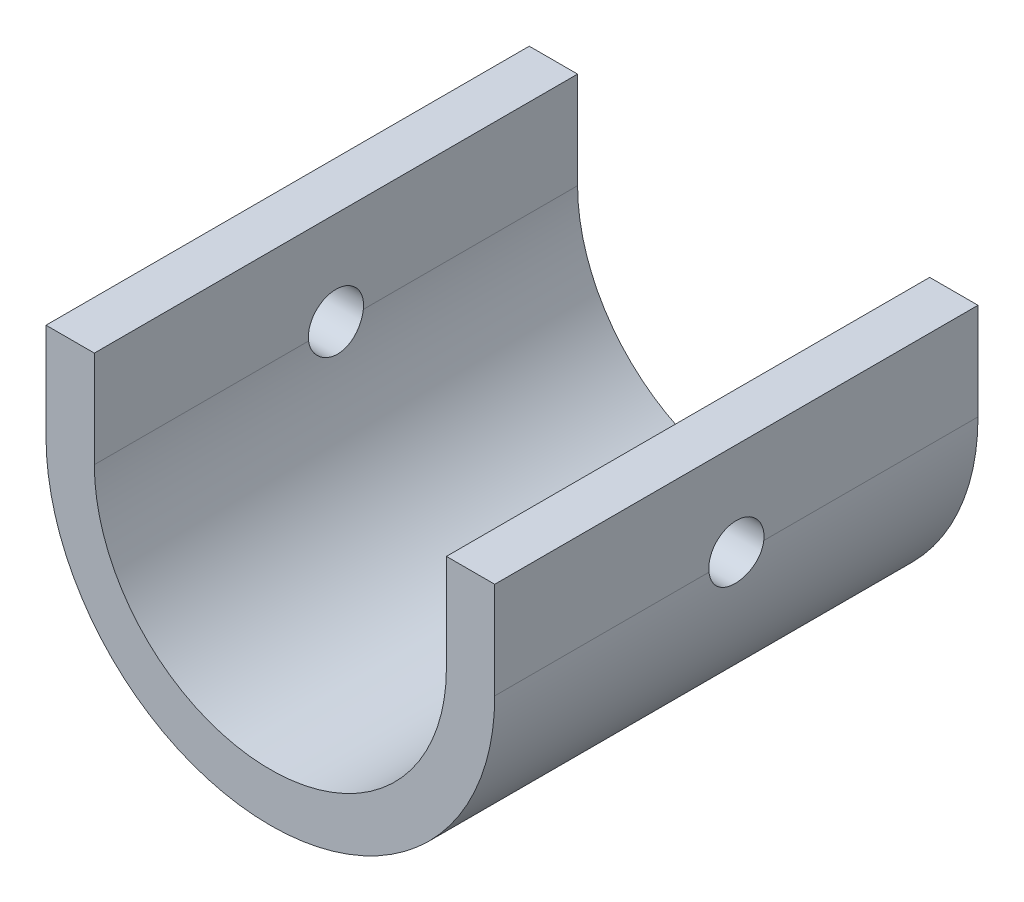
ISO-10303-21;
HEADER;
FILE_DESCRIPTION(('STEP AP214'),'2;1');
FILE_NAME('part.step','',(''),(''),'','','');
FILE_SCHEMA(('AUTOMOTIVE_DESIGN { 1 0 10303 214 1 1 1 1 }'));
ENDSEC;
DATA;
#1=APPLICATION_CONTEXT('core data for automotive mechanical design processes');
#2=APPLICATION_PROTOCOL_DEFINITION('international standard','automotive_design',2000,#1);
#3=PRODUCT_CONTEXT('',#1,'mechanical');
#4=PRODUCT('Part','Part','',(#3));
#5=PRODUCT_RELATED_PRODUCT_CATEGORY('part','',(#4));
#6=PRODUCT_DEFINITION_FORMATION('','',#4);
#7=PRODUCT_DEFINITION_CONTEXT('part definition',#1,'design');
#8=PRODUCT_DEFINITION('design','',#6,#7);
#9=PRODUCT_DEFINITION_SHAPE('','',#8);
#10=(LENGTH_UNIT() NAMED_UNIT(*) SI_UNIT(.MILLI.,.METRE.));
#11=(NAMED_UNIT(*) PLANE_ANGLE_UNIT() SI_UNIT($,.RADIAN.));
#12=(NAMED_UNIT(*) SI_UNIT($,.STERADIAN.) SOLID_ANGLE_UNIT());
#13=UNCERTAINTY_MEASURE_WITH_UNIT(LENGTH_MEASURE(1.E-05),#10,'distance_accuracy_value','');
#14=(GEOMETRIC_REPRESENTATION_CONTEXT(3) GLOBAL_UNCERTAINTY_ASSIGNED_CONTEXT((#13)) GLOBAL_UNIT_ASSIGNED_CONTEXT((#10,
#11,#12)) REPRESENTATION_CONTEXT('',''));
#15=CARTESIAN_POINT('',(0.,0.,0.));
#16=DIRECTION('',(0.,0.,1.));
#17=DIRECTION('',(1.,0.,0.));
#18=AXIS2_PLACEMENT_3D('',#15,#16,#17);
#19=CARTESIAN_POINT('',(0.,0.,-35.));
#20=DIRECTION('',(0.,0.,1.));
#21=DIRECTION('',(1.,0.,0.));
#22=AXIS2_PLACEMENT_3D('',#19,#20,#21);
#23=CYLINDRICAL_SURFACE('',#22,16.25);
#24=CARTESIAN_POINT('',(16.25,0.,-15.5156865167016));
#25=CARTESIAN_POINT('',(16.2500015653937,-0.055653435891597,-15.5226983306142));
#26=CARTESIAN_POINT('',(16.2497137674043,-0.110984720217965,-15.5320492738749));
#27=CARTESIAN_POINT('',(16.2485940851192,-0.220657744088929,-15.5553594094796));
#28=CARTESIAN_POINT('',(16.2477622439758,-0.27499956176471,-15.569318236292));
#29=CARTESIAN_POINT('',(16.2445065745714,-0.435836708734245,-15.6179434540853));
#30=CARTESIAN_POINT('',(16.2413223453314,-0.540353109414619,-15.6593851901989));
#31=CARTESIAN_POINT('',(16.2334116914427,-0.740915506000547,-15.7591232025484));
#32=CARTESIAN_POINT('',(16.2286847701001,-0.836958761175939,-15.8174249064255));
#33=CARTESIAN_POINT('',(16.2183398842306,-1.01792429968761,-15.9492291839831));
#34=CARTESIAN_POINT('',(16.2127220013382,-1.10284760058977,-16.0227303651986));
#35=CARTESIAN_POINT('',(16.201304162751,-1.25954696742681,-16.1832228231417));
#36=CARTESIAN_POINT('',(16.1955035321071,-1.33126535365999,-16.2702703555859));
#37=CARTESIAN_POINT('',(16.1844877892691,-1.45910416166925,-16.4552036602699));
#38=CARTESIAN_POINT('',(16.1792727555673,-1.51522249392426,-16.5530908819593));
#39=CARTESIAN_POINT('',(16.1700875480444,-1.61029953879071,-16.7570600110073));
#40=CARTESIAN_POINT('',(16.1661187427973,-1.64923940534476,-16.8631507690919));
#41=CARTESIAN_POINT('',(16.1599393704227,-1.70873124483421,-17.0804106559725));
#42=CARTESIAN_POINT('',(16.1577286462535,-1.72928486015344,-17.1915793302422));
#43=CARTESIAN_POINT('',(16.155352453196,-1.75134580655332,-17.4152542869928));
#44=CARTESIAN_POINT('',(16.1551768925576,-1.75294711711452,-17.5277511979941));
#45=CARTESIAN_POINT('',(16.1568669595704,-1.73729959616058,-17.7514103452006));
#46=CARTESIAN_POINT('',(16.1587325813369,-1.72005081899073,-17.8625725852527));
#47=CARTESIAN_POINT('',(16.1642628680002,-1.66727337904687,-18.0801419233242));
#48=CARTESIAN_POINT('',(16.1679232968112,-1.63178774926917,-18.1865595774253));
#49=CARTESIAN_POINT('',(16.1765819827535,-1.54358281846924,-18.3919369191943));
#50=CARTESIAN_POINT('',(16.1815802784569,-1.49086302055748,-18.4908963917293));
#51=CARTESIAN_POINT('',(16.192309993604,-1.36942168738256,-18.679008424877));
#52=CARTESIAN_POINT('',(16.198044438295,-1.3006331025488,-18.7681175224661));
#53=CARTESIAN_POINT('',(16.2094985117489,-1.14909339998459,-18.9335696466883));
#54=CARTESIAN_POINT('',(16.2152181386339,-1.06634059269709,-19.0099111263155));
#55=CARTESIAN_POINT('',(16.2259167931169,-0.888848502637455,-19.1479436428324));
#56=CARTESIAN_POINT('',(16.2308928300438,-0.794063509808882,-19.209576084041));
#57=CARTESIAN_POINT('',(16.2393898076645,-0.595449185629431,-19.3160078115115));
#58=CARTESIAN_POINT('',(16.2429118451123,-0.491626743086171,-19.3608197831562));
#59=CARTESIAN_POINT('',(16.2469244303084,-0.322298657730376,-19.4175078503865));
#60=CARTESIAN_POINT('',(16.2480663855521,-0.258738760865244,-19.4353375649568));
#61=CARTESIAN_POINT('',(16.2496054781649,-0.130264289473203,-19.4646205866167));
#62=CARTESIAN_POINT('',(16.250003795088,-0.0653520257485115,-19.4760839716058));
#63=CARTESIAN_POINT('',(16.25,0.,-19.4843134832984));
#64=B_SPLINE_CURVE_WITH_KNOTS('',3,(#24,#25,#26,#27,#28,#29,#30,#31,#32,#33,#34,#35,#36,#37,#38,
#39,#40,#41,#42,#43,#44,#45,#46,#47,#48,#49,#50,#51,#52,#53,#54,#55,#56,#57,#58,#59,#60,#61,#62,
#63),.UNSPECIFIED.,.F.,.F.,(4,2,2,2,2,2,2,2,2,2,2,2,2,2,2,2,2,2,2,4),(0.,0.168175927278946,
0.336338516794899,0.672038618206038,1.00784691032672,1.34362445176147,1.68083558443386,
2.0180918625036,2.35571722127854,2.69331241806959,3.02923286385338,3.36515234117233,
3.70028277346574,4.03542286897538,4.37198719004935,4.70859226189814,5.04651666784022,
5.38418570905532,5.58195955731673,5.77941943062865),.UNSPECIFIED.);
#65=CARTESIAN_POINT('',(16.25,0.,-15.5156865167016));
#66=VERTEX_POINT('',#65);
#67=CARTESIAN_POINT('',(16.25,0.,-19.4843134832984));
#68=VERTEX_POINT('',#67);
#69=EDGE_CURVE('E54',#66,#68,#64,.T.);
#70=ORIENTED_EDGE('',*,*,#69,.F.);
#71=DIRECTION('',(0.,0.,1.));
#72=VECTOR('',#71,1.);
#73=CARTESIAN_POINT('',(16.25,0.,-35.));
#74=LINE('',#73,#72);
#75=CARTESIAN_POINT('',(16.25,0.,0.));
#76=VERTEX_POINT('',#75);
#77=EDGE_CURVE('E135',#66,#76,#74,.T.);
#78=ORIENTED_EDGE('',*,*,#77,.T.);
#79=CARTESIAN_POINT('',(0.,0.,0.));
#80=DIRECTION('',(0.,0.,1.));
#81=DIRECTION('',(1.,0.,0.));
#82=AXIS2_PLACEMENT_3D('',#79,#80,#81);
#83=CIRCLE('',#82,16.25);
#84=CARTESIAN_POINT('',(-16.25,0.,0.));
#85=VERTEX_POINT('',#84);
#86=EDGE_CURVE('E166',#85,#76,#83,.T.);
#87=ORIENTED_EDGE('',*,*,#86,.F.);
#88=DIRECTION('',(0.,0.,1.));
#89=VECTOR('',#88,1.);
#90=CARTESIAN_POINT('',(-16.25,0.,-35.));
#91=LINE('',#90,#89);
#92=CARTESIAN_POINT('',(-16.25,0.,-15.5156865167016));
#93=VERTEX_POINT('',#92);
#94=EDGE_CURVE('E152',#93,#85,#91,.T.);
#95=ORIENTED_EDGE('',*,*,#94,.F.);
#96=CARTESIAN_POINT('',(-16.25,0.,-15.5156865167016));
#97=CARTESIAN_POINT('',(-16.2500015653937,-0.055653435891595,-15.5226983306142));
#98=CARTESIAN_POINT('',(-16.2497137674043,-0.110984720217963,-15.5320492738749));
#99=CARTESIAN_POINT('',(-16.2485940851192,-0.220657744088927,-15.5553594094796));
#100=CARTESIAN_POINT('',(-16.2477622439758,-0.274999561764708,-15.569318236292));
#101=CARTESIAN_POINT('',(-16.2445065745714,-0.435836708734243,-15.6179434540853));
#102=CARTESIAN_POINT('',(-16.2413223453314,-0.540353109414617,-15.6593851901989));
#103=CARTESIAN_POINT('',(-16.2334116914427,-0.740915506000545,-15.7591232025484));
#104=CARTESIAN_POINT('',(-16.2286847701001,-0.836958761175938,-15.8174249064255));
#105=CARTESIAN_POINT('',(-16.2183398842306,-1.01792429968761,-15.9492291839831));
#106=CARTESIAN_POINT('',(-16.2127220013382,-1.10284760058977,-16.0227303651986));
#107=CARTESIAN_POINT('',(-16.201304162751,-1.25954696742681,-16.1832228231417));
#108=CARTESIAN_POINT('',(-16.1955035321071,-1.33126535365999,-16.2702703555859));
#109=CARTESIAN_POINT('',(-16.1844877892691,-1.45910416166925,-16.4552036602699));
#110=CARTESIAN_POINT('',(-16.1792727555673,-1.51522249392426,-16.5530908819593));
#111=CARTESIAN_POINT('',(-16.1700875480444,-1.61029953879071,-16.7570600110073));
#112=CARTESIAN_POINT('',(-16.1661187427973,-1.64923940534476,-16.8631507690919));
#113=CARTESIAN_POINT('',(-16.1599393704227,-1.70873124483421,-17.0804106559725));
#114=CARTESIAN_POINT('',(-16.1577286462535,-1.72928486015344,-17.1915793302422));
#115=CARTESIAN_POINT('',(-16.155352453196,-1.75134580655332,-17.4152542869928));
#116=CARTESIAN_POINT('',(-16.1551768925576,-1.75294711711452,-17.5277511979941));
#117=CARTESIAN_POINT('',(-16.1568669595704,-1.73729959616058,-17.7514103452006));
#118=CARTESIAN_POINT('',(-16.1587325813369,-1.72005081899073,-17.8625725852527));
#119=CARTESIAN_POINT('',(-16.1642628680002,-1.66727337904687,-18.0801419233242));
#120=CARTESIAN_POINT('',(-16.1679232968112,-1.63178774926917,-18.1865595774253));
#121=CARTESIAN_POINT('',(-16.1765819827535,-1.54358281846924,-18.3919369191943));
#122=CARTESIAN_POINT('',(-16.1815802784569,-1.49086302055747,-18.4908963917293));
#123=CARTESIAN_POINT('',(-16.192309993604,-1.36942168738257,-18.679008424877));
#124=CARTESIAN_POINT('',(-16.198044438295,-1.3006331025488,-18.7681175224661));
#125=CARTESIAN_POINT('',(-16.2094985117489,-1.14909339998459,-18.9335696466883));
#126=CARTESIAN_POINT('',(-16.2152181386339,-1.06634059269709,-19.0099111263155));
#127=CARTESIAN_POINT('',(-16.2259167931169,-0.888848502637458,-19.1479436428324));
#128=CARTESIAN_POINT('',(-16.2308928300438,-0.794063509808885,-19.209576084041));
#129=CARTESIAN_POINT('',(-16.2393898076645,-0.595449185629433,-19.3160078115115));
#130=CARTESIAN_POINT('',(-16.2429118451123,-0.491626743086172,-19.3608197831562));
#131=CARTESIAN_POINT('',(-16.2469244303084,-0.322298657730376,-19.4175078503865));
#132=CARTESIAN_POINT('',(-16.2480663855521,-0.258738760865243,-19.4353375649568));
#133=CARTESIAN_POINT('',(-16.2496054781649,-0.130264289473201,-19.4646205866167));
#134=CARTESIAN_POINT('',(-16.250003795088,-0.065352025748509,-19.4760839716058));
#135=CARTESIAN_POINT('',(-16.25,0.,-19.4843134832984));
#136=B_SPLINE_CURVE_WITH_KNOTS('',3,(#96,#97,#98,#99,#100,#101,#102,#103,#104,#105,#106,#107,
#108,#109,#110,#111,#112,#113,#114,#115,#116,#117,#118,#119,#120,#121,#122,#123,#124,#125,#126,
#127,#128,#129,#130,#131,#132,#133,#134,#135),.UNSPECIFIED.,.F.,.F.,(4,2,2,2,2,2,2,2,2,2,2,2,2,
2,2,2,2,2,2,4),(0.,0.168175927278946,0.336338516794899,0.672038618206038,1.00784691032672,
1.34362445176147,1.68083558443386,2.0180918625036,2.35571722127855,2.69331241806959,
3.02923286385339,3.36515234117233,3.70028277346575,4.03542286897538,4.37198719004935,
4.70859226189814,5.04651666784021,5.38418570905532,5.58195955731673,5.77941943062865),.UNSPECIFIED.);
#137=CARTESIAN_POINT('',(-16.25,0.,-19.4843134832984));
#138=VERTEX_POINT('',#137);
#139=EDGE_CURVE('E257',#93,#138,#136,.T.);
#140=ORIENTED_EDGE('',*,*,#139,.T.);
#141=CARTESIAN_POINT('',(-16.25,0.,-35.));
#142=VERTEX_POINT('',#141);
#143=EDGE_CURVE('E157',#142,#138,#91,.T.);
#144=ORIENTED_EDGE('',*,*,#143,.F.);
#145=CARTESIAN_POINT('',(0.,0.,-35.));
#146=DIRECTION('',(0.,0.,1.));
#147=DIRECTION('',(1.,0.,0.));
#148=AXIS2_PLACEMENT_3D('',#145,#146,#147);
#149=CIRCLE('',#148,16.25);
#150=CARTESIAN_POINT('',(16.25,0.,-35.));
#151=VERTEX_POINT('',#150);
#152=EDGE_CURVE('E170',#142,#151,#149,.T.);
#153=ORIENTED_EDGE('',*,*,#152,.T.);
#154=EDGE_CURVE('E138',#151,#68,#74,.T.);
#155=ORIENTED_EDGE('',*,*,#154,.T.);
#156=EDGE_LOOP('',(#70,#78,#87,#95,#140,#144,#153,#155));
#157=FACE_BOUND('',#156,.T.);
#158=ADVANCED_FACE('F39',(#157),#23,.T.);
#159=CARTESIAN_POINT('',(0.,0.,-35.));
#160=DIRECTION('',(0.,0.,1.));
#161=DIRECTION('',(1.,0.,0.));
#162=AXIS2_PLACEMENT_3D('',#159,#160,#161);
#163=CYLINDRICAL_SURFACE('',#162,12.75);
#164=DIRECTION('',(0.,0.,1.));
#165=VECTOR('',#164,1.);
#166=CARTESIAN_POINT('',(12.75,0.,-35.));
#167=LINE('',#166,#165);
#168=CARTESIAN_POINT('',(12.75,0.,0.));
#169=VERTEX_POINT('',#168);
#170=CARTESIAN_POINT('',(12.75,0.,-15.5156865167016));
#171=VERTEX_POINT('',#170);
#172=EDGE_CURVE('E181',#169,#171,#167,.F.);
#173=ORIENTED_EDGE('',*,*,#172,.T.);
#174=CARTESIAN_POINT('',(12.75,0.,-15.5156865167016));
#175=CARTESIAN_POINT('',(12.7500019823259,-0.0555459104248471,-15.5226846392623));
#176=CARTESIAN_POINT('',(12.7496366052787,-0.110770606036139,-15.5320131071527));
#177=CARTESIAN_POINT('',(12.7482150311856,-0.220230793773209,-15.5552593693715));
#178=CARTESIAN_POINT('',(12.7471589022158,-0.274466382837561,-15.5691767113832));
#179=CARTESIAN_POINT('',(12.7430256795552,-0.43496945274398,-15.6176424606988));
#180=CARTESIAN_POINT('',(12.738983398653,-0.539260279929183,-15.6589334558758));
#181=CARTESIAN_POINT('',(12.7289389113226,-0.739384796080866,-15.7582713081251));
#182=CARTESIAN_POINT('',(12.7229362431457,-0.835216485824843,-15.8163221124199));
#183=CARTESIAN_POINT('',(12.7097916366241,-1.01582448559224,-15.9475372306867));
#184=CARTESIAN_POINT('',(12.7026497302155,-1.10060110540118,-16.0207011210108));
#185=CARTESIAN_POINT('',(12.6881016648746,-1.25730985932378,-16.1806660809222));
#186=CARTESIAN_POINT('',(12.6806940250715,-1.32914953695951,-16.267557577447));
#187=CARTESIAN_POINT('',(12.6666109107127,-1.4572697596049,-16.45221256416));
#188=CARTESIAN_POINT('',(12.6599355277796,-1.51354835889452,-16.549977411785));
#189=CARTESIAN_POINT('',(12.6481578812441,-1.60901598087677,-16.7538422776427));
#190=CARTESIAN_POINT('',(12.6430586083877,-1.64817257137658,-16.8599576687502));
#191=CARTESIAN_POINT('',(12.6351057220364,-1.70807654235961,-17.0773369283919));
#192=CARTESIAN_POINT('',(12.6322518622685,-1.72882594174195,-17.1886002308949));
#193=CARTESIAN_POINT('',(12.6291696595492,-1.75120030356984,-17.4121606088703));
#194=CARTESIAN_POINT('',(12.6289203167666,-1.75297823265907,-17.524442098232));
#195=CARTESIAN_POINT('',(12.6310241032355,-1.73775348480014,-17.747698231883));
#196=CARTESIAN_POINT('',(12.6333772002391,-1.72075104056776,-17.8586728923485));
#197=CARTESIAN_POINT('',(12.6403727285631,-1.66857995697854,-18.0757277552502));
#198=CARTESIAN_POINT('',(12.6450062231918,-1.63348220630697,-18.1818253101163));
#199=CARTESIAN_POINT('',(12.6559767728514,-1.54618121223193,-18.38663799082));
#200=CARTESIAN_POINT('',(12.6623139107521,-1.49397713670304,-18.48535275724));
#201=CARTESIAN_POINT('',(12.6759470668604,-1.37351839633283,-18.6733446364352));
#202=CARTESIAN_POINT('',(12.6832494173857,-1.3051551554944,-18.7625517094753));
#203=CARTESIAN_POINT('',(12.6978511635886,-1.15446540349922,-18.9282931665022));
#204=CARTESIAN_POINT('',(12.7051505587428,-1.07213703245764,-19.0048258598205));
#205=CARTESIAN_POINT('',(12.7188420090206,-0.895247555729168,-19.1435092313658));
#206=CARTESIAN_POINT('',(12.7252281064842,-0.800613192864179,-19.2055670070589));
#207=CARTESIAN_POINT('',(12.7361574117312,-0.602186721294556,-19.3128633984538));
#208=CARTESIAN_POINT('',(12.7407020320764,-0.498401706576717,-19.3581149036922));
#209=CARTESIAN_POINT('',(12.7459393213529,-0.328013267084846,-19.4158338823871));
#210=CARTESIAN_POINT('',(12.7474465395899,-0.263358420275937,-19.4341578445234));
#211=CARTESIAN_POINT('',(12.7494787915869,-0.132619593209395,-19.4642037860857));
#212=CARTESIAN_POINT('',(12.7500052904795,-0.0665378942361266,-19.4759355954279));
#213=CARTESIAN_POINT('',(12.75,0.,-19.4843134832985));
#214=B_SPLINE_CURVE_WITH_KNOTS('',3,(#174,#175,#176,#177,#178,#179,#180,#181,#182,#183,#184,
#185,#186,#187,#188,#189,#190,#191,#192,#193,#194,#195,#196,#197,#198,#199,#200,#201,#202,#203,
#204,#205,#206,#207,#208,#209,#210,#211,#212,#213),.UNSPECIFIED.,.F.,.F.,(4,2,2,2,2,2,2,2,2,2,2,
2,2,2,2,2,2,2,2,4),(0.,0.167850371346322,0.335684202939616,0.670674074812966,1.005742906997,
1.34080234785317,1.67816875686227,2.0155773303046,2.35362227715581,2.69163014268098,
3.02691057723162,3.36218685722323,3.69615955554619,4.03014850215376,4.36644877830834,
4.70279387836108,5.04124169184351,5.37942939476462,5.5807681315005,5.78180583894589),.UNSPECIFIED.);
#215=CARTESIAN_POINT('',(12.75,0.,-19.4843134832984));
#216=VERTEX_POINT('',#215);
#217=EDGE_CURVE('E60',#171,#216,#214,.T.);
#218=ORIENTED_EDGE('',*,*,#217,.T.);
#219=CARTESIAN_POINT('',(12.75,0.,-35.));
#220=VERTEX_POINT('',#219);
#221=EDGE_CURVE('E180',#216,#220,#167,.F.);
#222=ORIENTED_EDGE('',*,*,#221,.T.);
#223=CARTESIAN_POINT('',(0.,0.,-35.));
#224=DIRECTION('',(0.,0.,1.));
#225=DIRECTION('',(1.,0.,0.));
#226=AXIS2_PLACEMENT_3D('',#223,#224,#225);
#227=CIRCLE('',#226,12.75);
#228=CARTESIAN_POINT('',(-12.75,0.,-35.));
#229=VERTEX_POINT('',#228);
#230=EDGE_CURVE('E162',#229,#220,#227,.T.);
#231=ORIENTED_EDGE('',*,*,#230,.F.);
#232=DIRECTION('',(0.,0.,1.));
#233=VECTOR('',#232,1.);
#234=CARTESIAN_POINT('',(-12.75,0.,-35.));
#235=LINE('',#234,#233);
#236=CARTESIAN_POINT('',(-12.75,0.,-19.4843134832984));
#237=VERTEX_POINT('',#236);
#238=EDGE_CURVE('E176',#229,#237,#235,.T.);
#239=ORIENTED_EDGE('',*,*,#238,.T.);
#240=CARTESIAN_POINT('',(-12.75,0.,-15.5156865167016));
#241=CARTESIAN_POINT('',(-12.7500019823259,-0.0555459104248455,-15.5226846392623));
#242=CARTESIAN_POINT('',(-12.7496366052787,-0.110770606036138,-15.5320131071527));
#243=CARTESIAN_POINT('',(-12.7482150311856,-0.220230793773207,-15.5552593693715));
#244=CARTESIAN_POINT('',(-12.7471589022158,-0.27446638283756,-15.5691767113832));
#245=CARTESIAN_POINT('',(-12.7430256795552,-0.434969452743979,-15.6176424606988));
#246=CARTESIAN_POINT('',(-12.738983398653,-0.539260279929181,-15.6589334558758));
#247=CARTESIAN_POINT('',(-12.7289389113226,-0.739384796080865,-15.7582713081251));
#248=CARTESIAN_POINT('',(-12.7229362431457,-0.835216485824842,-15.8163221124199));
#249=CARTESIAN_POINT('',(-12.7097916366241,-1.01582448559224,-15.9475372306867));
#250=CARTESIAN_POINT('',(-12.7026497302155,-1.10060110540118,-16.0207011210108));
#251=CARTESIAN_POINT('',(-12.6881016648746,-1.25730985932378,-16.1806660809222));
#252=CARTESIAN_POINT('',(-12.6806940250715,-1.3291495369595,-16.267557577447));
#253=CARTESIAN_POINT('',(-12.6666109107127,-1.4572697596049,-16.45221256416));
#254=CARTESIAN_POINT('',(-12.6599355277796,-1.51354835889452,-16.549977411785));
#255=CARTESIAN_POINT('',(-12.6481578812441,-1.60901598087677,-16.7538422776427));
#256=CARTESIAN_POINT('',(-12.6430586083877,-1.64817257137658,-16.8599576687502));
#257=CARTESIAN_POINT('',(-12.6351057220364,-1.70807654235961,-17.0773369283919));
#258=CARTESIAN_POINT('',(-12.6322518622685,-1.72882594174195,-17.1886002308949));
#259=CARTESIAN_POINT('',(-12.6291696595492,-1.75120030356984,-17.4121606088703));
#260=CARTESIAN_POINT('',(-12.6289203167666,-1.75297823265907,-17.524442098232));
#261=CARTESIAN_POINT('',(-12.6310241032355,-1.73775348480014,-17.747698231883));
#262=CARTESIAN_POINT('',(-12.6333772002391,-1.72075104056776,-17.8586728923485));
#263=CARTESIAN_POINT('',(-12.6403727285631,-1.66857995697854,-18.0757277552502));
#264=CARTESIAN_POINT('',(-12.6450062231918,-1.63348220630697,-18.1818253101163));
#265=CARTESIAN_POINT('',(-12.6559767728514,-1.54618121223193,-18.38663799082));
#266=CARTESIAN_POINT('',(-12.6623139107521,-1.49397713670304,-18.48535275724));
#267=CARTESIAN_POINT('',(-12.6759470668604,-1.37351839633283,-18.6733446364352));
#268=CARTESIAN_POINT('',(-12.6832494173857,-1.3051551554944,-18.7625517094753));
#269=CARTESIAN_POINT('',(-12.6978511635886,-1.15446540349922,-18.9282931665022));
#270=CARTESIAN_POINT('',(-12.7051505587428,-1.07213703245764,-19.0048258598205));
#271=CARTESIAN_POINT('',(-12.7188420090206,-0.895247555729171,-19.1435092313658));
#272=CARTESIAN_POINT('',(-12.7252281064842,-0.800613192864182,-19.2055670070589));
#273=CARTESIAN_POINT('',(-12.7361574117312,-0.602186721294558,-19.3128633984538));
#274=CARTESIAN_POINT('',(-12.7407020320764,-0.498401706576717,-19.3581149036922));
#275=CARTESIAN_POINT('',(-12.7459393213529,-0.328013267084846,-19.4158338823871));
#276=CARTESIAN_POINT('',(-12.7474465395899,-0.263358420275937,-19.4341578445234));
#277=CARTESIAN_POINT('',(-12.7494787915869,-0.132619593209394,-19.4642037860857));
#278=CARTESIAN_POINT('',(-12.7500052904795,-0.0665378942361256,-19.4759355954279));
#279=CARTESIAN_POINT('',(-12.75,0.,-19.4843134832985));
#280=B_SPLINE_CURVE_WITH_KNOTS('',3,(#240,#241,#242,#243,#244,#245,#246,#247,#248,#249,#250,
#251,#252,#253,#254,#255,#256,#257,#258,#259,#260,#261,#262,#263,#264,#265,#266,#267,#268,#269,
#270,#271,#272,#273,#274,#275,#276,#277,#278,#279),.UNSPECIFIED.,.F.,.F.,(4,2,2,2,2,2,2,2,2,2,2,
2,2,2,2,2,2,2,2,4),(0.,0.167850371346322,0.335684202939615,0.670674074812966,1.005742906997,
1.34080234785317,1.67816875686227,2.0155773303046,2.35362227715581,2.69163014268098,
3.02691057723162,3.36218685722323,3.69615955554619,4.03014850215376,4.36644877830834,
4.70279387836108,5.04124169184351,5.37942939476462,5.5807681315005,5.7818058389459),.UNSPECIFIED.);
#281=CARTESIAN_POINT('',(-12.75,0.,-15.5156865167016));
#282=VERTEX_POINT('',#281);
#283=EDGE_CURVE('E196',#282,#237,#280,.T.);
#284=ORIENTED_EDGE('',*,*,#283,.F.);
#285=CARTESIAN_POINT('',(-12.75,0.,0.));
#286=VERTEX_POINT('',#285);
#287=EDGE_CURVE('E173',#282,#286,#235,.T.);
#288=ORIENTED_EDGE('',*,*,#287,.T.);
#289=CARTESIAN_POINT('',(0.,0.,0.));
#290=DIRECTION('',(0.,0.,1.));
#291=DIRECTION('',(1.,0.,0.));
#292=AXIS2_PLACEMENT_3D('',#289,#290,#291);
#293=CIRCLE('',#292,12.75);
#294=EDGE_CURVE('E161',#286,#169,#293,.T.);
#295=ORIENTED_EDGE('',*,*,#294,.T.);
#296=EDGE_LOOP('',(#173,#218,#222,#231,#239,#284,#288,#295));
#297=FACE_BOUND('',#296,.T.);
#298=ADVANCED_FACE('F195',(#297),#163,.F.);
#299=CARTESIAN_POINT('',(0.,0.,-35.));
#300=DIRECTION('',(0.,0.,1.));
#301=DIRECTION('',(1.,0.,0.));
#302=AXIS2_PLACEMENT_3D('',#299,#300,#301);
#303=PLANE('',#302);
#304=DIRECTION('',(0.,-1.,0.));
#305=VECTOR('',#304,1.);
#306=CARTESIAN_POINT('',(12.75,7.,-35.));
#307=LINE('',#306,#305);
#308=CARTESIAN_POINT('',(12.75,7.,-35.));
#309=VERTEX_POINT('',#308);
#310=EDGE_CURVE('E203',#309,#220,#307,.T.);
#311=ORIENTED_EDGE('',*,*,#310,.F.);
#312=DIRECTION('',(-1.,0.,0.));
#313=VECTOR('',#312,1.);
#314=CARTESIAN_POINT('',(-16.25,7.,-35.));
#315=LINE('',#314,#313);
#316=CARTESIAN_POINT('',(16.25,7.,-35.));
#317=VERTEX_POINT('',#316);
#318=EDGE_CURVE('E232',#317,#309,#315,.T.);
#319=ORIENTED_EDGE('',*,*,#318,.F.);
#320=DIRECTION('',(0.,-1.,0.));
#321=VECTOR('',#320,1.);
#322=CARTESIAN_POINT('',(16.25,7.,-35.));
#323=LINE('',#322,#321);
#324=EDGE_CURVE('E238',#317,#151,#323,.T.);
#325=ORIENTED_EDGE('',*,*,#324,.T.);
#326=ORIENTED_EDGE('',*,*,#152,.F.);
#327=DIRECTION('',(0.,-1.,0.));
#328=VECTOR('',#327,1.);
#329=CARTESIAN_POINT('',(-16.25,7.,-35.));
#330=LINE('',#329,#328);
#331=CARTESIAN_POINT('',(-16.25,7.,-35.));
#332=VERTEX_POINT('',#331);
#333=EDGE_CURVE('E235',#332,#142,#330,.T.);
#334=ORIENTED_EDGE('',*,*,#333,.F.);
#335=CARTESIAN_POINT('',(-12.75,7.,-35.));
#336=VERTEX_POINT('',#335);
#337=EDGE_CURVE('E208',#336,#332,#315,.T.);
#338=ORIENTED_EDGE('',*,*,#337,.F.);
#339=DIRECTION('',(0.,-1.,0.));
#340=VECTOR('',#339,1.);
#341=CARTESIAN_POINT('',(-12.75,7.,-35.));
#342=LINE('',#341,#340);
#343=EDGE_CURVE('E206',#336,#229,#342,.T.);
#344=ORIENTED_EDGE('',*,*,#343,.T.);
#345=ORIENTED_EDGE('',*,*,#230,.T.);
#346=EDGE_LOOP('',(#311,#319,#325,#326,#334,#338,#344,#345));
#347=FACE_BOUND('',#346,.T.);
#348=ADVANCED_FACE('F201',(#347),#303,.F.);
#349=CARTESIAN_POINT('',(0.,0.,0.));
#350=DIRECTION('',(0.,0.,1.));
#351=DIRECTION('',(1.,0.,0.));
#352=AXIS2_PLACEMENT_3D('',#349,#350,#351);
#353=PLANE('',#352);
#354=DIRECTION('',(1.,0.,0.));
#355=VECTOR('',#354,1.);
#356=CARTESIAN_POINT('',(-16.25,7.,0.));
#357=LINE('',#356,#355);
#358=CARTESIAN_POINT('',(12.75,7.,0.));
#359=VERTEX_POINT('',#358);
#360=CARTESIAN_POINT('',(16.25,7.,0.));
#361=VERTEX_POINT('',#360);
#362=EDGE_CURVE('E224',#359,#361,#357,.T.);
#363=ORIENTED_EDGE('',*,*,#362,.F.);
#364=DIRECTION('',(0.,-1.,0.));
#365=VECTOR('',#364,1.);
#366=CARTESIAN_POINT('',(12.75,7.,0.));
#367=LINE('',#366,#365);
#368=EDGE_CURVE('E217',#359,#169,#367,.T.);
#369=ORIENTED_EDGE('',*,*,#368,.T.);
#370=ORIENTED_EDGE('',*,*,#294,.F.);
#371=DIRECTION('',(0.,-1.,0.));
#372=VECTOR('',#371,1.);
#373=CARTESIAN_POINT('',(-12.75,7.,0.));
#374=LINE('',#373,#372);
#375=CARTESIAN_POINT('',(-12.75,7.,0.));
#376=VERTEX_POINT('',#375);
#377=EDGE_CURVE('E211',#376,#286,#374,.T.);
#378=ORIENTED_EDGE('',*,*,#377,.F.);
#379=CARTESIAN_POINT('',(-16.25,7.,0.));
#380=VERTEX_POINT('',#379);
#381=EDGE_CURVE('E225',#380,#376,#357,.T.);
#382=ORIENTED_EDGE('',*,*,#381,.F.);
#383=DIRECTION('',(0.,-1.,0.));
#384=VECTOR('',#383,1.);
#385=CARTESIAN_POINT('',(-16.25,7.,0.));
#386=LINE('',#385,#384);
#387=EDGE_CURVE('E148',#380,#85,#386,.T.);
#388=ORIENTED_EDGE('',*,*,#387,.T.);
#389=ORIENTED_EDGE('',*,*,#86,.T.);
#390=DIRECTION('',(0.,-1.,0.));
#391=VECTOR('',#390,1.);
#392=CARTESIAN_POINT('',(16.25,7.,0.));
#393=LINE('',#392,#391);
#394=EDGE_CURVE('E145',#361,#76,#393,.T.);
#395=ORIENTED_EDGE('',*,*,#394,.F.);
#396=EDGE_LOOP('',(#363,#369,#370,#378,#382,#388,#389,#395));
#397=FACE_BOUND('',#396,.T.);
#398=ADVANCED_FACE('F251',(#397),#353,.T.);
#399=CARTESIAN_POINT('',(0.,7.,0.));
#400=DIRECTION('',(0.,1.,0.));
#401=DIRECTION('',(0.,0.,1.));
#402=AXIS2_PLACEMENT_3D('',#399,#400,#401);
#403=PLANE('',#402);
#404=ORIENTED_EDGE('',*,*,#318,.T.);
#405=DIRECTION('',(0.,0.,-1.));
#406=VECTOR('',#405,1.);
#407=CARTESIAN_POINT('',(12.75,7.,0.));
#408=LINE('',#407,#406);
#409=EDGE_CURVE('E248',#359,#309,#408,.T.);
#410=ORIENTED_EDGE('',*,*,#409,.F.);
#411=ORIENTED_EDGE('',*,*,#362,.T.);
#412=DIRECTION('',(0.,0.,-1.));
#413=VECTOR('',#412,1.);
#414=CARTESIAN_POINT('',(16.25,7.,-35.));
#415=LINE('',#414,#413);
#416=EDGE_CURVE('E229',#361,#317,#415,.T.);
#417=ORIENTED_EDGE('',*,*,#416,.T.);
#418=EDGE_LOOP('',(#404,#410,#411,#417));
#419=FACE_BOUND('',#418,.T.);
#420=ADVANCED_FACE('F246',(#419),#403,.T.);
#421=ORIENTED_EDGE('',*,*,#381,.T.);
#422=DIRECTION('',(0.,0.,1.));
#423=VECTOR('',#422,1.);
#424=CARTESIAN_POINT('',(-12.75,7.,0.));
#425=LINE('',#424,#423);
#426=EDGE_CURVE('E264',#336,#376,#425,.T.);
#427=ORIENTED_EDGE('',*,*,#426,.F.);
#428=ORIENTED_EDGE('',*,*,#337,.T.);
#429=DIRECTION('',(0.,0.,1.));
#430=VECTOR('',#429,1.);
#431=CARTESIAN_POINT('',(-16.25,7.,-35.));
#432=LINE('',#431,#430);
#433=EDGE_CURVE('E215',#332,#380,#432,.T.);
#434=ORIENTED_EDGE('',*,*,#433,.T.);
#435=EDGE_LOOP('',(#421,#427,#428,#434));
#436=FACE_BOUND('',#435,.T.);
#437=ADVANCED_FACE('F263',(#436),#403,.T.);
#438=CARTESIAN_POINT('',(-16.25,7.,-35.));
#439=DIRECTION('',(1.,0.,0.));
#440=DIRECTION('',(0.,0.,-1.));
#441=AXIS2_PLACEMENT_3D('',#438,#439,#440);
#442=PLANE('',#441);
#443=CARTESIAN_POINT('',(-16.25,0.25,-17.5));
#444=DIRECTION('',(1.,0.,0.));
#445=DIRECTION('',(0.,0.,-1.));
#446=AXIS2_PLACEMENT_3D('',#443,#444,#445);
#447=CIRCLE('',#446,2.);
#448=EDGE_CURVE('E140',#138,#93,#447,.T.);
#449=ORIENTED_EDGE('',*,*,#448,.T.);
#450=ORIENTED_EDGE('',*,*,#94,.T.);
#451=ORIENTED_EDGE('',*,*,#387,.F.);
#452=ORIENTED_EDGE('',*,*,#433,.F.);
#453=ORIENTED_EDGE('',*,*,#333,.T.);
#454=ORIENTED_EDGE('',*,*,#143,.T.);
#455=EDGE_LOOP('',(#449,#450,#451,#452,#453,#454));
#456=FACE_BOUND('',#455,.T.);
#457=ADVANCED_FACE('F260',(#456),#442,.F.);
#458=CARTESIAN_POINT('',(16.25,7.,-35.));
#459=DIRECTION('',(-1.,0.,0.));
#460=DIRECTION('',(0.,0.,1.));
#461=AXIS2_PLACEMENT_3D('',#458,#459,#460);
#462=PLANE('',#461);
#463=ORIENTED_EDGE('',*,*,#77,.F.);
#464=CARTESIAN_POINT('',(16.25,0.25,-17.5));
#465=DIRECTION('',(1.,0.,0.));
#466=DIRECTION('',(0.,0.,-1.));
#467=AXIS2_PLACEMENT_3D('',#464,#465,#466);
#468=CIRCLE('',#467,2.);
#469=EDGE_CURVE('E125',#68,#66,#468,.T.);
#470=ORIENTED_EDGE('',*,*,#469,.F.);
#471=ORIENTED_EDGE('',*,*,#154,.F.);
#472=ORIENTED_EDGE('',*,*,#324,.F.);
#473=ORIENTED_EDGE('',*,*,#416,.F.);
#474=ORIENTED_EDGE('',*,*,#394,.T.);
#475=EDGE_LOOP('',(#463,#470,#471,#472,#473,#474));
#476=FACE_BOUND('',#475,.T.);
#477=ADVANCED_FACE('F142',(#476),#462,.F.);
#478=CARTESIAN_POINT('',(-12.75,7.,0.));
#479=DIRECTION('',(1.,0.,0.));
#480=DIRECTION('',(0.,0.,-1.));
#481=AXIS2_PLACEMENT_3D('',#478,#479,#480);
#482=PLANE('',#481);
#483=ORIENTED_EDGE('',*,*,#287,.F.);
#484=CARTESIAN_POINT('',(-12.75,0.25,-17.5));
#485=DIRECTION('',(1.,0.,0.));
#486=DIRECTION('',(0.,0.,-1.));
#487=AXIS2_PLACEMENT_3D('',#484,#485,#486);
#488=CIRCLE('',#487,2.);
#489=EDGE_CURVE('E48',#282,#237,#488,.F.);
#490=ORIENTED_EDGE('',*,*,#489,.T.);
#491=ORIENTED_EDGE('',*,*,#238,.F.);
#492=ORIENTED_EDGE('',*,*,#343,.F.);
#493=ORIENTED_EDGE('',*,*,#426,.T.);
#494=ORIENTED_EDGE('',*,*,#377,.T.);
#495=EDGE_LOOP('',(#483,#490,#491,#492,#493,#494));
#496=FACE_BOUND('',#495,.T.);
#497=ADVANCED_FACE('F188',(#496),#482,.T.);
#498=CARTESIAN_POINT('',(12.75,7.,0.));
#499=DIRECTION('',(-1.,0.,0.));
#500=DIRECTION('',(0.,0.,1.));
#501=AXIS2_PLACEMENT_3D('',#498,#499,#500);
#502=PLANE('',#501);
#503=CARTESIAN_POINT('',(12.75,0.25,-17.5));
#504=DIRECTION('',(-1.,0.,0.));
#505=DIRECTION('',(0.,0.,1.));
#506=AXIS2_PLACEMENT_3D('',#503,#504,#505);
#507=CIRCLE('',#506,2.);
#508=EDGE_CURVE('E11',#171,#216,#507,.T.);
#509=ORIENTED_EDGE('',*,*,#508,.F.);
#510=ORIENTED_EDGE('',*,*,#172,.F.);
#511=ORIENTED_EDGE('',*,*,#368,.F.);
#512=ORIENTED_EDGE('',*,*,#409,.T.);
#513=ORIENTED_EDGE('',*,*,#310,.T.);
#514=ORIENTED_EDGE('',*,*,#221,.F.);
#515=EDGE_LOOP('',(#509,#510,#511,#512,#513,#514));
#516=FACE_BOUND('',#515,.T.);
#517=ADVANCED_FACE('F290',(#516),#502,.T.);
#518=CARTESIAN_POINT('',(-12.25,0.25,-17.5));
#519=DIRECTION('',(-1.,0.,0.));
#520=DIRECTION('',(0.,0.,1.));
#521=AXIS2_PLACEMENT_3D('',#518,#519,#520);
#522=CYLINDRICAL_SURFACE('',#521,2.);
#523=ORIENTED_EDGE('',*,*,#448,.F.);
#524=ORIENTED_EDGE('',*,*,#139,.F.);
#525=EDGE_LOOP('',(#523,#524));
#526=FACE_BOUND('',#525,.T.);
#527=ORIENTED_EDGE('',*,*,#283,.T.);
#528=ORIENTED_EDGE('',*,*,#489,.F.);
#529=EDGE_LOOP('',(#527,#528));
#530=FACE_BOUND('',#529,.T.);
#531=ADVANCED_FACE('F285',(#526,#530),#522,.F.);
#532=CARTESIAN_POINT('',(12.25,0.25,-17.5));
#533=DIRECTION('',(1.,0.,0.));
#534=DIRECTION('',(0.,0.,-1.));
#535=AXIS2_PLACEMENT_3D('',#532,#533,#534);
#536=CYLINDRICAL_SURFACE('',#535,2.);
#537=ORIENTED_EDGE('',*,*,#69,.T.);
#538=ORIENTED_EDGE('',*,*,#469,.T.);
#539=EDGE_LOOP('',(#537,#538));
#540=FACE_BOUND('',#539,.T.);
#541=ORIENTED_EDGE('',*,*,#508,.T.);
#542=ORIENTED_EDGE('',*,*,#217,.F.);
#543=EDGE_LOOP('',(#541,#542));
#544=FACE_BOUND('',#543,.T.);
#545=ADVANCED_FACE('F126',(#540,#544),#536,.F.);
#546=CLOSED_SHELL('',(#158,#298,#348,#398,#420,#437,#457,#477,#497,#517,#531,#545));
#547=MANIFOLD_SOLID_BREP('B2',#546);
#548=ADVANCED_BREP_SHAPE_REPRESENTATION('',(#18,#547),#14);
#549=SHAPE_DEFINITION_REPRESENTATION(#9,#548);
ENDSEC;
END-ISO-10303-21;
